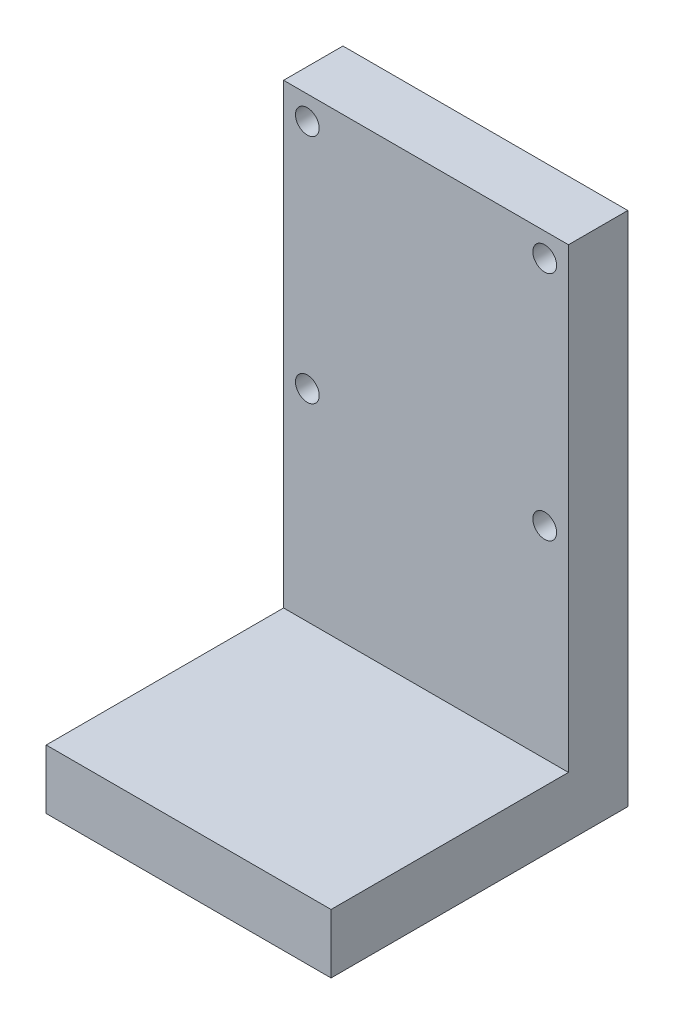
ISO-10303-21;
HEADER;
FILE_DESCRIPTION(('STEP AP214'),'2;1');
FILE_NAME('part.step','',(''),(''),'','','');
FILE_SCHEMA(('AUTOMOTIVE_DESIGN { 1 0 10303 214 1 1 1 1 }'));
ENDSEC;
DATA;
#1=APPLICATION_CONTEXT('core data for automotive mechanical design processes');
#2=APPLICATION_PROTOCOL_DEFINITION('international standard','automotive_design',2000,#1);
#3=PRODUCT_CONTEXT('',#1,'mechanical');
#4=PRODUCT('Part','Part','',(#3));
#5=PRODUCT_RELATED_PRODUCT_CATEGORY('part','',(#4));
#6=PRODUCT_DEFINITION_FORMATION('','',#4);
#7=PRODUCT_DEFINITION_CONTEXT('part definition',#1,'design');
#8=PRODUCT_DEFINITION('design','',#6,#7);
#9=PRODUCT_DEFINITION_SHAPE('','',#8);
#10=(LENGTH_UNIT() NAMED_UNIT(*) SI_UNIT(.MILLI.,.METRE.));
#11=(NAMED_UNIT(*) PLANE_ANGLE_UNIT() SI_UNIT($,.RADIAN.));
#12=(NAMED_UNIT(*) SI_UNIT($,.STERADIAN.) SOLID_ANGLE_UNIT());
#13=UNCERTAINTY_MEASURE_WITH_UNIT(LENGTH_MEASURE(1.E-05),#10,'distance_accuracy_value','');
#14=(GEOMETRIC_REPRESENTATION_CONTEXT(3) GLOBAL_UNCERTAINTY_ASSIGNED_CONTEXT((#13)) GLOBAL_UNIT_ASSIGNED_CONTEXT((#10,
#11,#12)) REPRESENTATION_CONTEXT('',''));
#15=CARTESIAN_POINT('',(0.,0.,0.));
#16=DIRECTION('',(0.,0.,1.));
#17=DIRECTION('',(1.,0.,0.));
#18=AXIS2_PLACEMENT_3D('',#15,#16,#17);
#19=CARTESIAN_POINT('',(-24.,0.,10.));
#20=DIRECTION('',(1.,0.,0.));
#21=DIRECTION('',(0.,0.,-1.));
#22=AXIS2_PLACEMENT_3D('',#19,#20,#21);
#23=PLANE('',#22);
#24=DIRECTION('',(0.,-1.,0.));
#25=VECTOR('',#24,1.);
#26=CARTESIAN_POINT('',(-24.,0.,0.));
#27=LINE('',#26,#25);
#28=CARTESIAN_POINT('',(-24.,23.5,0.));
#29=VERTEX_POINT('',#28);
#30=CARTESIAN_POINT('',(-24.,-63.5,0.));
#31=VERTEX_POINT('',#30);
#32=EDGE_CURVE('E83',#29,#31,#27,.T.);
#33=ORIENTED_EDGE('',*,*,#32,.T.);
#34=DIRECTION('',(0.,0.,-1.));
#35=VECTOR('',#34,1.);
#36=CARTESIAN_POINT('',(-24.,-63.5,10.));
#37=LINE('',#36,#35);
#38=CARTESIAN_POINT('',(-24.,-63.5,50.));
#39=VERTEX_POINT('',#38);
#40=EDGE_CURVE('E11',#39,#31,#37,.T.);
#41=ORIENTED_EDGE('',*,*,#40,.F.);
#42=DIRECTION('',(0.,-1.,0.));
#43=VECTOR('',#42,1.);
#44=CARTESIAN_POINT('',(-24.,0.,50.));
#45=LINE('',#44,#43);
#46=CARTESIAN_POINT('',(-24.,-53.5,50.));
#47=VERTEX_POINT('',#46);
#48=EDGE_CURVE('E151',#47,#39,#45,.T.);
#49=ORIENTED_EDGE('',*,*,#48,.F.);
#50=DIRECTION('',(0.,0.,-1.));
#51=VECTOR('',#50,1.);
#52=CARTESIAN_POINT('',(-24.,-53.5,50.));
#53=LINE('',#52,#51);
#54=CARTESIAN_POINT('',(-24.,-53.5,10.));
#55=VERTEX_POINT('',#54);
#56=EDGE_CURVE('E165',#47,#55,#53,.T.);
#57=ORIENTED_EDGE('',*,*,#56,.T.);
#58=DIRECTION('',(0.,-1.,0.));
#59=VECTOR('',#58,1.);
#60=CARTESIAN_POINT('',(-24.,0.,10.));
#61=LINE('',#60,#59);
#62=CARTESIAN_POINT('',(-24.,23.5,10.));
#63=VERTEX_POINT('',#62);
#64=EDGE_CURVE('E56',#63,#55,#61,.T.);
#65=ORIENTED_EDGE('',*,*,#64,.F.);
#66=DIRECTION('',(0.,0.,-1.));
#67=VECTOR('',#66,1.);
#68=CARTESIAN_POINT('',(-24.,23.5,10.));
#69=LINE('',#68,#67);
#70=EDGE_CURVE('E65',#63,#29,#69,.T.);
#71=ORIENTED_EDGE('',*,*,#70,.T.);
#72=EDGE_LOOP('',(#33,#41,#49,#57,#65,#71));
#73=FACE_BOUND('',#72,.T.);
#74=ADVANCED_FACE('F41',(#73),#23,.F.);
#75=CARTESIAN_POINT('',(0.,-63.5,10.));
#76=DIRECTION('',(0.,1.,0.));
#77=DIRECTION('',(0.,0.,1.));
#78=AXIS2_PLACEMENT_3D('',#75,#76,#77);
#79=PLANE('',#78);
#80=DIRECTION('',(1.,0.,0.));
#81=VECTOR('',#80,1.);
#82=CARTESIAN_POINT('',(0.,-63.5,0.));
#83=LINE('',#82,#81);
#84=CARTESIAN_POINT('',(24.,-63.5,0.));
#85=VERTEX_POINT('',#84);
#86=EDGE_CURVE('E96',#31,#85,#83,.T.);
#87=ORIENTED_EDGE('',*,*,#86,.T.);
#88=DIRECTION('',(0.,0.,-1.));
#89=VECTOR('',#88,1.);
#90=CARTESIAN_POINT('',(24.,-63.5,10.));
#91=LINE('',#90,#89);
#92=CARTESIAN_POINT('',(24.,-63.5,50.));
#93=VERTEX_POINT('',#92);
#94=EDGE_CURVE('E49',#93,#85,#91,.T.);
#95=ORIENTED_EDGE('',*,*,#94,.F.);
#96=DIRECTION('',(1.,0.,0.));
#97=VECTOR('',#96,1.);
#98=CARTESIAN_POINT('',(0.,-63.5,50.));
#99=LINE('',#98,#97);
#100=EDGE_CURVE('E143',#39,#93,#99,.T.);
#101=ORIENTED_EDGE('',*,*,#100,.F.);
#102=ORIENTED_EDGE('',*,*,#40,.T.);
#103=EDGE_LOOP('',(#87,#95,#101,#102));
#104=FACE_BOUND('',#103,.T.);
#105=ADVANCED_FACE('F141',(#104),#79,.F.);
#106=CARTESIAN_POINT('',(24.,0.,10.));
#107=DIRECTION('',(-1.,0.,0.));
#108=DIRECTION('',(0.,0.,1.));
#109=AXIS2_PLACEMENT_3D('',#106,#107,#108);
#110=PLANE('',#109);
#111=DIRECTION('',(0.,1.,0.));
#112=VECTOR('',#111,1.);
#113=CARTESIAN_POINT('',(24.,0.,10.));
#114=LINE('',#113,#112);
#115=CARTESIAN_POINT('',(24.,-53.5,10.));
#116=VERTEX_POINT('',#115);
#117=CARTESIAN_POINT('',(24.,23.5,10.));
#118=VERTEX_POINT('',#117);
#119=EDGE_CURVE('E172',#116,#118,#114,.T.);
#120=ORIENTED_EDGE('',*,*,#119,.F.);
#121=DIRECTION('',(0.,0.,-1.));
#122=VECTOR('',#121,1.);
#123=CARTESIAN_POINT('',(24.,-53.5,50.));
#124=LINE('',#123,#122);
#125=CARTESIAN_POINT('',(24.,-53.5,50.));
#126=VERTEX_POINT('',#125);
#127=EDGE_CURVE('E156',#126,#116,#124,.T.);
#128=ORIENTED_EDGE('',*,*,#127,.F.);
#129=DIRECTION('',(0.,1.,0.));
#130=VECTOR('',#129,1.);
#131=CARTESIAN_POINT('',(24.,0.,50.));
#132=LINE('',#131,#130);
#133=EDGE_CURVE('E137',#93,#126,#132,.T.);
#134=ORIENTED_EDGE('',*,*,#133,.F.);
#135=ORIENTED_EDGE('',*,*,#94,.T.);
#136=DIRECTION('',(0.,1.,0.));
#137=VECTOR('',#136,1.);
#138=CARTESIAN_POINT('',(24.,0.,0.));
#139=LINE('',#138,#137);
#140=CARTESIAN_POINT('',(24.,23.5,0.));
#141=VERTEX_POINT('',#140);
#142=EDGE_CURVE('E105',#85,#141,#139,.T.);
#143=ORIENTED_EDGE('',*,*,#142,.T.);
#144=DIRECTION('',(0.,0.,-1.));
#145=VECTOR('',#144,1.);
#146=CARTESIAN_POINT('',(24.,23.5,10.));
#147=LINE('',#146,#145);
#148=EDGE_CURVE('E87',#118,#141,#147,.T.);
#149=ORIENTED_EDGE('',*,*,#148,.F.);
#150=EDGE_LOOP('',(#120,#128,#134,#135,#143,#149));
#151=FACE_BOUND('',#150,.T.);
#152=ADVANCED_FACE('F133',(#151),#110,.F.);
#153=CARTESIAN_POINT('',(20.,-19.5,10.));
#154=DIRECTION('',(0.,0.,-1.));
#155=DIRECTION('',(-1.,0.,0.));
#156=AXIS2_PLACEMENT_3D('',#153,#154,#155);
#157=CYLINDRICAL_SURFACE('',#156,2.);
#158=CARTESIAN_POINT('',(20.,-19.5,10.));
#159=DIRECTION('',(0.,0.,1.));
#160=DIRECTION('',(1.,0.,0.));
#161=AXIS2_PLACEMENT_3D('',#158,#159,#160);
#162=CIRCLE('',#161,2.);
#163=CARTESIAN_POINT('',(22.,-19.5,10.));
#164=VERTEX_POINT('',#163);
#165=EDGE_CURVE('E186',#164,#164,#162,.T.);
#166=ORIENTED_EDGE('',*,*,#165,.T.);
#167=EDGE_LOOP('',(#166));
#168=FACE_BOUND('',#167,.T.);
#169=CARTESIAN_POINT('',(20.,-19.5,0.));
#170=DIRECTION('',(0.,0.,1.));
#171=DIRECTION('',(1.,0.,0.));
#172=AXIS2_PLACEMENT_3D('',#169,#170,#171);
#173=CIRCLE('',#172,2.);
#174=CARTESIAN_POINT('',(22.,-19.5,0.));
#175=VERTEX_POINT('',#174);
#176=EDGE_CURVE('E118',#175,#175,#173,.T.);
#177=ORIENTED_EDGE('',*,*,#176,.F.);
#178=EDGE_LOOP('',(#177));
#179=FACE_BOUND('',#178,.T.);
#180=ADVANCED_FACE('F217',(#168,#179),#157,.F.);
#181=CARTESIAN_POINT('',(-20.,-19.5,10.));
#182=DIRECTION('',(0.,0.,-1.));
#183=DIRECTION('',(-1.,0.,0.));
#184=AXIS2_PLACEMENT_3D('',#181,#182,#183);
#185=CYLINDRICAL_SURFACE('',#184,2.);
#186=CARTESIAN_POINT('',(-20.,-19.5,10.));
#187=DIRECTION('',(0.,0.,1.));
#188=DIRECTION('',(1.,0.,0.));
#189=AXIS2_PLACEMENT_3D('',#186,#187,#188);
#190=CIRCLE('',#189,2.);
#191=CARTESIAN_POINT('',(-18.,-19.5,10.));
#192=VERTEX_POINT('',#191);
#193=EDGE_CURVE('E182',#192,#192,#190,.T.);
#194=ORIENTED_EDGE('',*,*,#193,.T.);
#195=EDGE_LOOP('',(#194));
#196=FACE_BOUND('',#195,.T.);
#197=CARTESIAN_POINT('',(-20.,-19.5,0.));
#198=DIRECTION('',(0.,0.,1.));
#199=DIRECTION('',(1.,0.,0.));
#200=AXIS2_PLACEMENT_3D('',#197,#198,#199);
#201=CIRCLE('',#200,2.);
#202=CARTESIAN_POINT('',(-18.,-19.5,0.));
#203=VERTEX_POINT('',#202);
#204=EDGE_CURVE('E110',#203,#203,#201,.T.);
#205=ORIENTED_EDGE('',*,*,#204,.F.);
#206=EDGE_LOOP('',(#205));
#207=FACE_BOUND('',#206,.T.);
#208=ADVANCED_FACE('F225',(#196,#207),#185,.F.);
#209=CARTESIAN_POINT('',(-20.,19.5,10.));
#210=DIRECTION('',(0.,0.,-1.));
#211=DIRECTION('',(-1.,0.,0.));
#212=AXIS2_PLACEMENT_3D('',#209,#210,#211);
#213=CYLINDRICAL_SURFACE('',#212,2.);
#214=CARTESIAN_POINT('',(-20.,19.5,10.));
#215=DIRECTION('',(0.,0.,1.));
#216=DIRECTION('',(1.,0.,0.));
#217=AXIS2_PLACEMENT_3D('',#214,#215,#216);
#218=CIRCLE('',#217,2.);
#219=CARTESIAN_POINT('',(-18.,19.5,10.));
#220=VERTEX_POINT('',#219);
#221=EDGE_CURVE('E178',#220,#220,#218,.T.);
#222=ORIENTED_EDGE('',*,*,#221,.T.);
#223=EDGE_LOOP('',(#222));
#224=FACE_BOUND('',#223,.T.);
#225=CARTESIAN_POINT('',(-20.,19.5,0.));
#226=DIRECTION('',(0.,0.,1.));
#227=DIRECTION('',(1.,0.,0.));
#228=AXIS2_PLACEMENT_3D('',#225,#226,#227);
#229=CIRCLE('',#228,2.);
#230=CARTESIAN_POINT('',(-18.,19.5,0.));
#231=VERTEX_POINT('',#230);
#232=EDGE_CURVE('E104',#231,#231,#229,.T.);
#233=ORIENTED_EDGE('',*,*,#232,.F.);
#234=EDGE_LOOP('',(#233));
#235=FACE_BOUND('',#234,.T.);
#236=ADVANCED_FACE('F222',(#224,#235),#213,.F.);
#237=CARTESIAN_POINT('',(0.,23.5,10.));
#238=DIRECTION('',(0.,1.,0.));
#239=DIRECTION('',(0.,0.,1.));
#240=AXIS2_PLACEMENT_3D('',#237,#238,#239);
#241=PLANE('',#240);
#242=DIRECTION('',(1.,0.,0.));
#243=VECTOR('',#242,1.);
#244=CARTESIAN_POINT('',(0.,23.5,0.));
#245=LINE('',#244,#243);
#246=EDGE_CURVE('E95',#29,#141,#245,.T.);
#247=ORIENTED_EDGE('',*,*,#246,.F.);
#248=ORIENTED_EDGE('',*,*,#70,.F.);
#249=DIRECTION('',(1.,0.,0.));
#250=VECTOR('',#249,1.);
#251=CARTESIAN_POINT('',(0.,23.5,10.));
#252=LINE('',#251,#250);
#253=EDGE_CURVE('E175',#63,#118,#252,.T.);
#254=ORIENTED_EDGE('',*,*,#253,.T.);
#255=ORIENTED_EDGE('',*,*,#148,.T.);
#256=EDGE_LOOP('',(#247,#248,#254,#255));
#257=FACE_BOUND('',#256,.T.);
#258=ADVANCED_FACE('F101',(#257),#241,.T.);
#259=CARTESIAN_POINT('',(20.,19.5,10.));
#260=DIRECTION('',(0.,0.,-1.));
#261=DIRECTION('',(-1.,0.,0.));
#262=AXIS2_PLACEMENT_3D('',#259,#260,#261);
#263=CYLINDRICAL_SURFACE('',#262,2.);
#264=CARTESIAN_POINT('',(20.,19.5,10.));
#265=DIRECTION('',(0.,0.,1.));
#266=DIRECTION('',(1.,0.,0.));
#267=AXIS2_PLACEMENT_3D('',#264,#265,#266);
#268=CIRCLE('',#267,2.);
#269=CARTESIAN_POINT('',(22.,19.5,10.));
#270=VERTEX_POINT('',#269);
#271=EDGE_CURVE('E88',#270,#270,#268,.T.);
#272=ORIENTED_EDGE('',*,*,#271,.T.);
#273=EDGE_LOOP('',(#272));
#274=FACE_BOUND('',#273,.T.);
#275=CARTESIAN_POINT('',(20.,19.5,0.));
#276=DIRECTION('',(0.,0.,1.));
#277=DIRECTION('',(1.,0.,0.));
#278=AXIS2_PLACEMENT_3D('',#275,#276,#277);
#279=CIRCLE('',#278,2.);
#280=CARTESIAN_POINT('',(22.,19.5,0.));
#281=VERTEX_POINT('',#280);
#282=EDGE_CURVE('E122',#281,#281,#279,.T.);
#283=ORIENTED_EDGE('',*,*,#282,.F.);
#284=EDGE_LOOP('',(#283));
#285=FACE_BOUND('',#284,.T.);
#286=ADVANCED_FACE('F195',(#274,#285),#263,.F.);
#287=CARTESIAN_POINT('',(0.,0.,10.));
#288=DIRECTION('',(0.,0.,1.));
#289=DIRECTION('',(1.,0.,0.));
#290=AXIS2_PLACEMENT_3D('',#287,#288,#289);
#291=PLANE('',#290);
#292=DIRECTION('',(-1.,0.,0.));
#293=VECTOR('',#292,1.);
#294=CARTESIAN_POINT('',(0.,-53.5,10.));
#295=LINE('',#294,#293);
#296=EDGE_CURVE('E98',#116,#55,#295,.T.);
#297=ORIENTED_EDGE('',*,*,#296,.F.);
#298=ORIENTED_EDGE('',*,*,#119,.T.);
#299=ORIENTED_EDGE('',*,*,#253,.F.);
#300=ORIENTED_EDGE('',*,*,#64,.T.);
#301=EDGE_LOOP('',(#297,#298,#299,#300));
#302=FACE_BOUND('',#301,.T.);
#303=ORIENTED_EDGE('',*,*,#221,.F.);
#304=EDGE_LOOP('',(#303));
#305=FACE_BOUND('',#304,.T.);
#306=ORIENTED_EDGE('',*,*,#193,.F.);
#307=EDGE_LOOP('',(#306));
#308=FACE_BOUND('',#307,.T.);
#309=ORIENTED_EDGE('',*,*,#165,.F.);
#310=EDGE_LOOP('',(#309));
#311=FACE_BOUND('',#310,.T.);
#312=ORIENTED_EDGE('',*,*,#271,.F.);
#313=EDGE_LOOP('',(#312));
#314=FACE_BOUND('',#313,.T.);
#315=ADVANCED_FACE('F198',(#302,#305,#308,#311,#314),#291,.T.);
#316=CARTESIAN_POINT('',(0.,0.,0.));
#317=DIRECTION('',(0.,0.,1.));
#318=DIRECTION('',(1.,0.,0.));
#319=AXIS2_PLACEMENT_3D('',#316,#317,#318);
#320=PLANE('',#319);
#321=ORIENTED_EDGE('',*,*,#246,.T.);
#322=ORIENTED_EDGE('',*,*,#142,.F.);
#323=ORIENTED_EDGE('',*,*,#86,.F.);
#324=ORIENTED_EDGE('',*,*,#32,.F.);
#325=EDGE_LOOP('',(#321,#322,#323,#324));
#326=FACE_BOUND('',#325,.T.);
#327=ORIENTED_EDGE('',*,*,#232,.T.);
#328=EDGE_LOOP('',(#327));
#329=FACE_BOUND('',#328,.T.);
#330=ORIENTED_EDGE('',*,*,#204,.T.);
#331=EDGE_LOOP('',(#330));
#332=FACE_BOUND('',#331,.T.);
#333=ORIENTED_EDGE('',*,*,#176,.T.);
#334=EDGE_LOOP('',(#333));
#335=FACE_BOUND('',#334,.T.);
#336=ORIENTED_EDGE('',*,*,#282,.T.);
#337=EDGE_LOOP('',(#336));
#338=FACE_BOUND('',#337,.T.);
#339=ADVANCED_FACE('F92',(#326,#329,#332,#335,#338),#320,.F.);
#340=CARTESIAN_POINT('',(0.,-53.5,50.));
#341=DIRECTION('',(0.,1.,0.));
#342=DIRECTION('',(-1.,0.,0.));
#343=AXIS2_PLACEMENT_3D('',#340,#341,#342);
#344=PLANE('',#343);
#345=ORIENTED_EDGE('',*,*,#127,.T.);
#346=ORIENTED_EDGE('',*,*,#296,.T.);
#347=ORIENTED_EDGE('',*,*,#56,.F.);
#348=DIRECTION('',(1.,0.,0.));
#349=VECTOR('',#348,1.);
#350=CARTESIAN_POINT('',(0.,-53.5,50.));
#351=LINE('',#350,#349);
#352=EDGE_CURVE('E158',#47,#126,#351,.T.);
#353=ORIENTED_EDGE('',*,*,#352,.T.);
#354=EDGE_LOOP('',(#345,#346,#347,#353));
#355=FACE_BOUND('',#354,.T.);
#356=ADVANCED_FACE('F205',(#355),#344,.T.);
#357=CARTESIAN_POINT('',(0.,0.,50.));
#358=DIRECTION('',(0.,0.,1.));
#359=DIRECTION('',(1.,0.,0.));
#360=AXIS2_PLACEMENT_3D('',#357,#358,#359);
#361=PLANE('',#360);
#362=ORIENTED_EDGE('',*,*,#352,.F.);
#363=ORIENTED_EDGE('',*,*,#48,.T.);
#364=ORIENTED_EDGE('',*,*,#100,.T.);
#365=ORIENTED_EDGE('',*,*,#133,.T.);
#366=EDGE_LOOP('',(#362,#363,#364,#365));
#367=FACE_BOUND('',#366,.T.);
#368=ADVANCED_FACE('F149',(#367),#361,.T.);
#369=CLOSED_SHELL('',(#74,#105,#152,#180,#208,#236,#258,#286,#315,#339,#356,#368));
#370=MANIFOLD_SOLID_BREP('B2',#369);
#371=ADVANCED_BREP_SHAPE_REPRESENTATION('',(#18,#370),#14);
#372=SHAPE_DEFINITION_REPRESENTATION(#9,#371);
ENDSEC;
END-ISO-10303-21;
